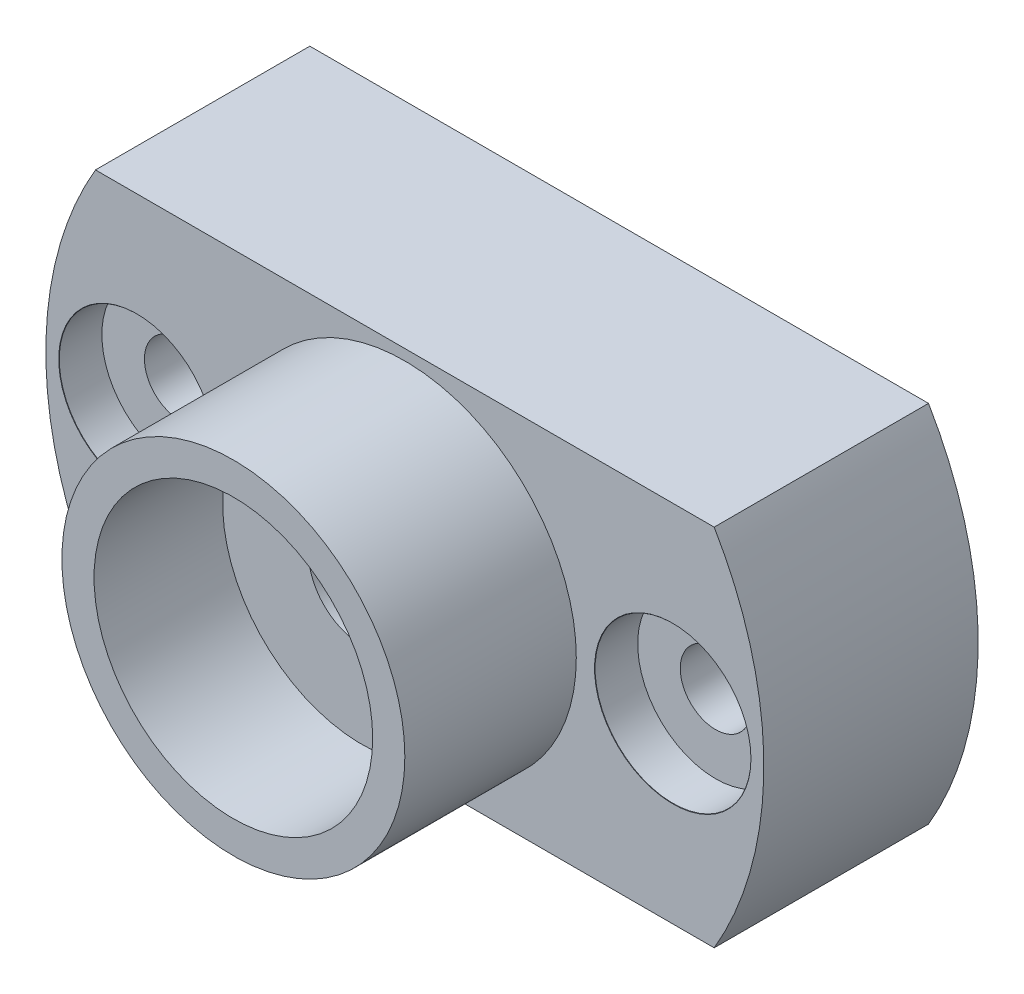
ISO-10303-21;
HEADER;
FILE_DESCRIPTION(('STEP AP214'),'2;1');
FILE_NAME('part.step','',(''),(''),'','','');
FILE_SCHEMA(('AUTOMOTIVE_DESIGN { 1 0 10303 214 1 1 1 1 }'));
ENDSEC;
DATA;
#1=APPLICATION_CONTEXT('core data for automotive mechanical design processes');
#2=APPLICATION_PROTOCOL_DEFINITION('international standard','automotive_design',2000,#1);
#3=PRODUCT_CONTEXT('',#1,'mechanical');
#4=PRODUCT('Part','Part','',(#3));
#5=PRODUCT_RELATED_PRODUCT_CATEGORY('part','',(#4));
#6=PRODUCT_DEFINITION_FORMATION('','',#4);
#7=PRODUCT_DEFINITION_CONTEXT('part definition',#1,'design');
#8=PRODUCT_DEFINITION('design','',#6,#7);
#9=PRODUCT_DEFINITION_SHAPE('','',#8);
#10=(LENGTH_UNIT() NAMED_UNIT(*) SI_UNIT(.MILLI.,.METRE.));
#11=(NAMED_UNIT(*) PLANE_ANGLE_UNIT() SI_UNIT($,.RADIAN.));
#12=(NAMED_UNIT(*) SI_UNIT($,.STERADIAN.) SOLID_ANGLE_UNIT());
#13=UNCERTAINTY_MEASURE_WITH_UNIT(LENGTH_MEASURE(1.E-05),#10,'distance_accuracy_value','');
#14=(GEOMETRIC_REPRESENTATION_CONTEXT(3) GLOBAL_UNCERTAINTY_ASSIGNED_CONTEXT((#13)) GLOBAL_UNIT_ASSIGNED_CONTEXT((#10,
#11,#12)) REPRESENTATION_CONTEXT('',''));
#15=CARTESIAN_POINT('',(0.,0.,0.));
#16=DIRECTION('',(0.,0.,1.));
#17=DIRECTION('',(1.,0.,0.));
#18=AXIS2_PLACEMENT_3D('',#15,#16,#17);
#19=CARTESIAN_POINT('',(0.,0.,-9.99999999999999));
#20=DIRECTION('',(0.,0.,1.));
#21=DIRECTION('',(1.,0.,0.));
#22=AXIS2_PLACEMENT_3D('',#19,#20,#21);
#23=CYLINDRICAL_SURFACE('',#22,5.);
#24=CARTESIAN_POINT('',(0.,0.,0.));
#25=DIRECTION('',(0.,0.,-1.));
#26=DIRECTION('',(-1.,0.,0.));
#27=AXIS2_PLACEMENT_3D('',#24,#25,#26);
#28=CIRCLE('',#27,5.);
#29=CARTESIAN_POINT('',(-5.,0.,0.));
#30=VERTEX_POINT('',#29);
#31=EDGE_CURVE('E148',#30,#30,#28,.T.);
#32=ORIENTED_EDGE('',*,*,#31,.T.);
#33=EDGE_LOOP('',(#32));
#34=FACE_BOUND('',#33,.T.);
#35=CARTESIAN_POINT('',(0.,0.,24.));
#36=DIRECTION('',(0.,0.,1.));
#37=DIRECTION('',(1.,0.,0.));
#38=AXIS2_PLACEMENT_3D('',#35,#36,#37);
#39=CIRCLE('',#38,5.);
#40=CARTESIAN_POINT('',(5.,0.,24.));
#41=VERTEX_POINT('',#40);
#42=EDGE_CURVE('E45',#41,#41,#39,.F.);
#43=ORIENTED_EDGE('',*,*,#42,.F.);
#44=EDGE_LOOP('',(#43));
#45=FACE_BOUND('',#44,.T.);
#46=ADVANCED_FACE('F41',(#34,#45),#23,.F.);
#47=CARTESIAN_POINT('',(-33.5,17.,20.));
#48=DIRECTION('',(0.,-1.,0.));
#49=DIRECTION('',(0.,0.,-1.));
#50=AXIS2_PLACEMENT_3D('',#47,#48,#49);
#51=PLANE('',#50);
#52=DIRECTION('',(0.,0.,1.));
#53=VECTOR('',#52,1.);
#54=CARTESIAN_POINT('',(28.8660700477221,17.,0.));
#55=LINE('',#54,#53);
#56=CARTESIAN_POINT('',(28.8660700477221,17.,0.));
#57=VERTEX_POINT('',#56);
#58=CARTESIAN_POINT('',(28.8660700477221,17.,20.));
#59=VERTEX_POINT('',#58);
#60=EDGE_CURVE('E81',#57,#59,#55,.T.);
#61=ORIENTED_EDGE('',*,*,#60,.F.);
#62=DIRECTION('',(-1.,0.,0.));
#63=VECTOR('',#62,1.);
#64=CARTESIAN_POINT('',(-33.5,17.,0.));
#65=LINE('',#64,#63);
#66=CARTESIAN_POINT('',(-28.8660700477221,17.,0.));
#67=VERTEX_POINT('',#66);
#68=EDGE_CURVE('E91',#57,#67,#65,.T.);
#69=ORIENTED_EDGE('',*,*,#68,.T.);
#70=DIRECTION('',(0.,0.,1.));
#71=VECTOR('',#70,1.);
#72=CARTESIAN_POINT('',(-28.8660700477221,17.,0.));
#73=LINE('',#72,#71);
#74=CARTESIAN_POINT('',(-28.8660700477221,17.,20.));
#75=VERTEX_POINT('',#74);
#76=EDGE_CURVE('E94',#75,#67,#73,.F.);
#77=ORIENTED_EDGE('',*,*,#76,.F.);
#78=DIRECTION('',(-1.,0.,0.));
#79=VECTOR('',#78,1.);
#80=CARTESIAN_POINT('',(-33.5,17.,20.));
#81=LINE('',#80,#79);
#82=EDGE_CURVE('E93',#59,#75,#81,.T.);
#83=ORIENTED_EDGE('',*,*,#82,.F.);
#84=EDGE_LOOP('',(#61,#69,#77,#83));
#85=FACE_BOUND('',#84,.T.);
#86=ADVANCED_FACE('F43',(#85),#51,.F.);
#87=CARTESIAN_POINT('',(-33.5,-17.,20.));
#88=DIRECTION('',(0.,1.,0.));
#89=DIRECTION('',(0.,0.,1.));
#90=AXIS2_PLACEMENT_3D('',#87,#88,#89);
#91=PLANE('',#90);
#92=DIRECTION('',(0.,0.,1.));
#93=VECTOR('',#92,1.);
#94=CARTESIAN_POINT('',(-28.8660700477221,-17.,0.));
#95=LINE('',#94,#93);
#96=CARTESIAN_POINT('',(-28.8660700477221,-17.,0.));
#97=VERTEX_POINT('',#96);
#98=CARTESIAN_POINT('',(-28.8660700477221,-17.,20.));
#99=VERTEX_POINT('',#98);
#100=EDGE_CURVE('E109',#97,#99,#95,.T.);
#101=ORIENTED_EDGE('',*,*,#100,.F.);
#102=DIRECTION('',(1.,0.,0.));
#103=VECTOR('',#102,1.);
#104=CARTESIAN_POINT('',(-33.5,-17.,0.));
#105=LINE('',#104,#103);
#106=CARTESIAN_POINT('',(28.8660700477221,-17.,0.));
#107=VERTEX_POINT('',#106);
#108=EDGE_CURVE('E98',#97,#107,#105,.T.);
#109=ORIENTED_EDGE('',*,*,#108,.T.);
#110=DIRECTION('',(0.,0.,1.));
#111=VECTOR('',#110,1.);
#112=CARTESIAN_POINT('',(28.8660700477221,-17.,0.));
#113=LINE('',#112,#111);
#114=CARTESIAN_POINT('',(28.8660700477221,-17.,20.));
#115=VERTEX_POINT('',#114);
#116=EDGE_CURVE('E58',#115,#107,#113,.F.);
#117=ORIENTED_EDGE('',*,*,#116,.F.);
#118=DIRECTION('',(1.,0.,0.));
#119=VECTOR('',#118,1.);
#120=CARTESIAN_POINT('',(-33.5,-17.,20.));
#121=LINE('',#120,#119);
#122=EDGE_CURVE('E102',#99,#115,#121,.T.);
#123=ORIENTED_EDGE('',*,*,#122,.F.);
#124=EDGE_LOOP('',(#101,#109,#117,#123));
#125=FACE_BOUND('',#124,.T.);
#126=ADVANCED_FACE('F169',(#125),#91,.F.);
#127=CARTESIAN_POINT('',(0.,0.,20.));
#128=DIRECTION('',(0.,0.,-1.));
#129=DIRECTION('',(-1.,0.,0.));
#130=AXIS2_PLACEMENT_3D('',#127,#128,#129);
#131=PLANE('',#130);
#132=CARTESIAN_POINT('',(-25.,0.,20.));
#133=DIRECTION('',(0.,0.,1.));
#134=DIRECTION('',(1.,0.,0.));
#135=AXIS2_PLACEMENT_3D('',#132,#133,#134);
#136=CIRCLE('',#135,7.2985);
#137=CARTESIAN_POINT('',(-17.7015,0.,20.));
#138=VERTEX_POINT('',#137);
#139=EDGE_CURVE('E145',#138,#138,#136,.T.);
#140=ORIENTED_EDGE('',*,*,#139,.F.);
#141=EDGE_LOOP('',(#140));
#142=FACE_BOUND('',#141,.T.);
#143=CARTESIAN_POINT('',(25.,0.,20.));
#144=DIRECTION('',(0.,0.,1.));
#145=DIRECTION('',(1.,0.,0.));
#146=AXIS2_PLACEMENT_3D('',#143,#144,#145);
#147=CIRCLE('',#146,7.2985);
#148=CARTESIAN_POINT('',(32.2985,0.,20.));
#149=VERTEX_POINT('',#148);
#150=EDGE_CURVE('E130',#149,#149,#147,.T.);
#151=ORIENTED_EDGE('',*,*,#150,.F.);
#152=EDGE_LOOP('',(#151));
#153=FACE_BOUND('',#152,.T.);
#154=CARTESIAN_POINT('',(0.,0.,20.));
#155=DIRECTION('',(0.,0.,1.));
#156=DIRECTION('',(1.,0.,0.));
#157=AXIS2_PLACEMENT_3D('',#154,#155,#156);
#158=CIRCLE('',#157,16.);
#159=CARTESIAN_POINT('',(16.,0.,20.));
#160=VERTEX_POINT('',#159);
#161=EDGE_CURVE('E12',#160,#160,#158,.T.);
#162=ORIENTED_EDGE('',*,*,#161,.F.);
#163=EDGE_LOOP('',(#162));
#164=FACE_BOUND('',#163,.T.);
#165=CARTESIAN_POINT('',(0.,0.,20.));
#166=DIRECTION('',(0.,0.,1.));
#167=DIRECTION('',(1.,0.,0.));
#168=AXIS2_PLACEMENT_3D('',#165,#166,#167);
#169=CIRCLE('',#168,33.5);
#170=EDGE_CURVE('E63',#115,#59,#169,.T.);
#171=ORIENTED_EDGE('',*,*,#170,.T.);
#172=ORIENTED_EDGE('',*,*,#82,.T.);
#173=EDGE_CURVE('E113',#75,#99,#169,.T.);
#174=ORIENTED_EDGE('',*,*,#173,.T.);
#175=ORIENTED_EDGE('',*,*,#122,.T.);
#176=EDGE_LOOP('',(#171,#172,#174,#175));
#177=FACE_BOUND('',#176,.T.);
#178=ADVANCED_FACE('F217',(#142,#153,#164,#177),#131,.F.);
#179=CARTESIAN_POINT('',(0.,0.,0.));
#180=DIRECTION('',(0.,0.,-1.));
#181=DIRECTION('',(-1.,0.,0.));
#182=AXIS2_PLACEMENT_3D('',#179,#180,#181);
#183=PLANE('',#182);
#184=ORIENTED_EDGE('',*,*,#31,.F.);
#185=EDGE_LOOP('',(#184));
#186=FACE_BOUND('',#185,.T.);
#187=CARTESIAN_POINT('',(-25.,0.,0.));
#188=DIRECTION('',(0.,0.,1.));
#189=DIRECTION('',(1.,0.,0.));
#190=AXIS2_PLACEMENT_3D('',#187,#188,#189);
#191=CIRCLE('',#190,3.29999999999999);
#192=CARTESIAN_POINT('',(-21.7,0.,0.));
#193=VERTEX_POINT('',#192);
#194=EDGE_CURVE('E133',#193,#193,#191,.T.);
#195=ORIENTED_EDGE('',*,*,#194,.T.);
#196=EDGE_LOOP('',(#195));
#197=FACE_BOUND('',#196,.T.);
#198=CARTESIAN_POINT('',(25.,0.,0.));
#199=DIRECTION('',(0.,0.,1.));
#200=DIRECTION('',(1.,0.,0.));
#201=AXIS2_PLACEMENT_3D('',#198,#199,#200);
#202=CIRCLE('',#201,3.29999999999999);
#203=CARTESIAN_POINT('',(28.3,0.,0.));
#204=VERTEX_POINT('',#203);
#205=EDGE_CURVE('E118',#204,#204,#202,.T.);
#206=ORIENTED_EDGE('',*,*,#205,.T.);
#207=EDGE_LOOP('',(#206));
#208=FACE_BOUND('',#207,.T.);
#209=ORIENTED_EDGE('',*,*,#68,.F.);
#210=CARTESIAN_POINT('',(0.,0.,0.));
#211=DIRECTION('',(0.,0.,-1.));
#212=DIRECTION('',(-1.,0.,0.));
#213=AXIS2_PLACEMENT_3D('',#210,#211,#212);
#214=CIRCLE('',#213,33.5);
#215=EDGE_CURVE('E50',#57,#107,#214,.T.);
#216=ORIENTED_EDGE('',*,*,#215,.T.);
#217=ORIENTED_EDGE('',*,*,#108,.F.);
#218=EDGE_CURVE('E87',#97,#67,#214,.T.);
#219=ORIENTED_EDGE('',*,*,#218,.T.);
#220=EDGE_LOOP('',(#209,#216,#217,#219));
#221=FACE_BOUND('',#220,.T.);
#222=ADVANCED_FACE('F96',(#186,#197,#208,#221),#183,.T.);
#223=CARTESIAN_POINT('',(0.,0.,0.));
#224=DIRECTION('',(0.,0.,1.));
#225=DIRECTION('',(1.,0.,0.));
#226=AXIS2_PLACEMENT_3D('',#223,#224,#225);
#227=CYLINDRICAL_SURFACE('',#226,33.5);
#228=ORIENTED_EDGE('',*,*,#76,.T.);
#229=ORIENTED_EDGE('',*,*,#218,.F.);
#230=ORIENTED_EDGE('',*,*,#100,.T.);
#231=ORIENTED_EDGE('',*,*,#173,.F.);
#232=EDGE_LOOP('',(#228,#229,#230,#231));
#233=FACE_BOUND('',#232,.T.);
#234=ADVANCED_FACE('F216',(#233),#227,.T.);
#235=ORIENTED_EDGE('',*,*,#215,.F.);
#236=ORIENTED_EDGE('',*,*,#60,.T.);
#237=ORIENTED_EDGE('',*,*,#170,.F.);
#238=ORIENTED_EDGE('',*,*,#116,.T.);
#239=EDGE_LOOP('',(#235,#236,#237,#238));
#240=FACE_BOUND('',#239,.T.);
#241=ADVANCED_FACE('F80',(#240),#227,.T.);
#242=CARTESIAN_POINT('',(0.,0.,36.));
#243=DIRECTION('',(0.,0.,-1.));
#244=DIRECTION('',(-1.,0.,0.));
#245=AXIS2_PLACEMENT_3D('',#242,#243,#244);
#246=CYLINDRICAL_SURFACE('',#245,16.);
#247=CARTESIAN_POINT('',(0.,0.,36.));
#248=DIRECTION('',(0.,0.,1.));
#249=DIRECTION('',(1.,0.,0.));
#250=AXIS2_PLACEMENT_3D('',#247,#248,#249);
#251=CIRCLE('',#250,16.);
#252=CARTESIAN_POINT('',(16.,0.,36.));
#253=VERTEX_POINT('',#252);
#254=EDGE_CURVE('E114',#253,#253,#251,.T.);
#255=ORIENTED_EDGE('',*,*,#254,.F.);
#256=EDGE_LOOP('',(#255));
#257=FACE_BOUND('',#256,.T.);
#258=ORIENTED_EDGE('',*,*,#161,.T.);
#259=EDGE_LOOP('',(#258));
#260=FACE_BOUND('',#259,.T.);
#261=ADVANCED_FACE('F209',(#257,#260),#246,.T.);
#262=CARTESIAN_POINT('',(0.,0.,36.));
#263=DIRECTION('',(0.,0.,1.));
#264=DIRECTION('',(1.,0.,0.));
#265=AXIS2_PLACEMENT_3D('',#262,#263,#264);
#266=PLANE('',#265);
#267=CARTESIAN_POINT('',(0.,0.,36.));
#268=DIRECTION('',(0.,0.,1.));
#269=DIRECTION('',(1.,0.,0.));
#270=AXIS2_PLACEMENT_3D('',#267,#268,#269);
#271=CIRCLE('',#270,13.);
#272=CARTESIAN_POINT('',(13.,0.,36.));
#273=VERTEX_POINT('',#272);
#274=EDGE_CURVE('E151',#273,#273,#271,.T.);
#275=ORIENTED_EDGE('',*,*,#274,.F.);
#276=EDGE_LOOP('',(#275));
#277=FACE_BOUND('',#276,.T.);
#278=ORIENTED_EDGE('',*,*,#254,.T.);
#279=EDGE_LOOP('',(#278));
#280=FACE_BOUND('',#279,.T.);
#281=ADVANCED_FACE('F205',(#277,#280),#266,.T.);
#282=CARTESIAN_POINT('',(25.,0.,20.));
#283=DIRECTION('',(0.,0.,1.));
#284=DIRECTION('',(1.,0.,0.));
#285=AXIS2_PLACEMENT_3D('',#282,#283,#284);
#286=CYLINDRICAL_SURFACE('',#285,3.3);
#287=ORIENTED_EDGE('',*,*,#205,.F.);
#288=EDGE_LOOP('',(#287));
#289=FACE_BOUND('',#288,.T.);
#290=CARTESIAN_POINT('',(25.,0.,16.));
#291=DIRECTION('',(0.,0.,1.));
#292=DIRECTION('',(1.,0.,0.));
#293=AXIS2_PLACEMENT_3D('',#290,#291,#292);
#294=CIRCLE('',#293,3.3);
#295=CARTESIAN_POINT('',(28.3,0.,16.));
#296=VERTEX_POINT('',#295);
#297=EDGE_CURVE('E121',#296,#296,#294,.T.);
#298=ORIENTED_EDGE('',*,*,#297,.T.);
#299=EDGE_LOOP('',(#298));
#300=FACE_BOUND('',#299,.T.);
#301=ADVANCED_FACE('F201',(#289,#300),#286,.F.);
#302=CARTESIAN_POINT('',(32.2735,0.,16.));
#303=DIRECTION('',(0.,0.,-1.));
#304=DIRECTION('',(-1.,0.,0.));
#305=AXIS2_PLACEMENT_3D('',#302,#303,#304);
#306=PLANE('',#305);
#307=ORIENTED_EDGE('',*,*,#297,.F.);
#308=EDGE_LOOP('',(#307));
#309=FACE_BOUND('',#308,.T.);
#310=CARTESIAN_POINT('',(25.,0.,16.));
#311=DIRECTION('',(0.,0.,1.));
#312=DIRECTION('',(1.,0.,0.));
#313=AXIS2_PLACEMENT_3D('',#310,#311,#312);
#314=CIRCLE('',#313,7.2735);
#315=CARTESIAN_POINT('',(32.2735,0.,16.));
#316=VERTEX_POINT('',#315);
#317=EDGE_CURVE('E124',#316,#316,#314,.T.);
#318=ORIENTED_EDGE('',*,*,#317,.T.);
#319=EDGE_LOOP('',(#318));
#320=FACE_BOUND('',#319,.T.);
#321=ADVANCED_FACE('F197',(#309,#320),#306,.F.);
#322=CARTESIAN_POINT('',(25.,0.,20.));
#323=DIRECTION('',(0.,0.,1.));
#324=DIRECTION('',(1.,0.,0.));
#325=AXIS2_PLACEMENT_3D('',#322,#323,#324);
#326=CYLINDRICAL_SURFACE('',#325,7.2735);
#327=ORIENTED_EDGE('',*,*,#317,.F.);
#328=EDGE_LOOP('',(#327));
#329=FACE_BOUND('',#328,.T.);
#330=CARTESIAN_POINT('',(25.,0.,19.975));
#331=DIRECTION('',(0.,0.,1.));
#332=DIRECTION('',(1.,0.,0.));
#333=AXIS2_PLACEMENT_3D('',#330,#331,#332);
#334=CIRCLE('',#333,7.2735);
#335=CARTESIAN_POINT('',(32.2735,0.,19.975));
#336=VERTEX_POINT('',#335);
#337=EDGE_CURVE('E127',#336,#336,#334,.T.);
#338=ORIENTED_EDGE('',*,*,#337,.T.);
#339=EDGE_LOOP('',(#338));
#340=FACE_BOUND('',#339,.T.);
#341=ADVANCED_FACE('F193',(#329,#340),#326,.F.);
#342=CARTESIAN_POINT('',(25.,0.,20.));
#343=DIRECTION('',(0.,0.,1.));
#344=DIRECTION('',(1.,0.,0.));
#345=AXIS2_PLACEMENT_3D('',#342,#343,#344);
#346=CONICAL_SURFACE('',#345,7.2985,0.785398163397379);
#347=ORIENTED_EDGE('',*,*,#337,.F.);
#348=EDGE_LOOP('',(#347));
#349=FACE_BOUND('',#348,.T.);
#350=ORIENTED_EDGE('',*,*,#150,.T.);
#351=EDGE_LOOP('',(#350));
#352=FACE_BOUND('',#351,.T.);
#353=ADVANCED_FACE('F189',(#349,#352),#346,.F.);
#354=CARTESIAN_POINT('',(-25.,0.,20.));
#355=DIRECTION('',(0.,0.,1.));
#356=DIRECTION('',(1.,0.,0.));
#357=AXIS2_PLACEMENT_3D('',#354,#355,#356);
#358=CYLINDRICAL_SURFACE('',#357,3.3);
#359=ORIENTED_EDGE('',*,*,#194,.F.);
#360=EDGE_LOOP('',(#359));
#361=FACE_BOUND('',#360,.T.);
#362=CARTESIAN_POINT('',(-25.,0.,16.));
#363=DIRECTION('',(0.,0.,1.));
#364=DIRECTION('',(1.,0.,0.));
#365=AXIS2_PLACEMENT_3D('',#362,#363,#364);
#366=CIRCLE('',#365,3.3);
#367=CARTESIAN_POINT('',(-21.7,0.,16.));
#368=VERTEX_POINT('',#367);
#369=EDGE_CURVE('E136',#368,#368,#366,.T.);
#370=ORIENTED_EDGE('',*,*,#369,.T.);
#371=EDGE_LOOP('',(#370));
#372=FACE_BOUND('',#371,.T.);
#373=ADVANCED_FACE('F185',(#361,#372),#358,.F.);
#374=CARTESIAN_POINT('',(-17.7265,0.,16.));
#375=DIRECTION('',(0.,0.,-1.));
#376=DIRECTION('',(-1.,0.,0.));
#377=AXIS2_PLACEMENT_3D('',#374,#375,#376);
#378=PLANE('',#377);
#379=ORIENTED_EDGE('',*,*,#369,.F.);
#380=EDGE_LOOP('',(#379));
#381=FACE_BOUND('',#380,.T.);
#382=CARTESIAN_POINT('',(-25.,0.,16.));
#383=DIRECTION('',(0.,0.,1.));
#384=DIRECTION('',(1.,0.,0.));
#385=AXIS2_PLACEMENT_3D('',#382,#383,#384);
#386=CIRCLE('',#385,7.2735);
#387=CARTESIAN_POINT('',(-17.7265,0.,16.));
#388=VERTEX_POINT('',#387);
#389=EDGE_CURVE('E139',#388,#388,#386,.T.);
#390=ORIENTED_EDGE('',*,*,#389,.T.);
#391=EDGE_LOOP('',(#390));
#392=FACE_BOUND('',#391,.T.);
#393=ADVANCED_FACE('F181',(#381,#392),#378,.F.);
#394=CARTESIAN_POINT('',(-25.,0.,20.));
#395=DIRECTION('',(0.,0.,1.));
#396=DIRECTION('',(1.,0.,0.));
#397=AXIS2_PLACEMENT_3D('',#394,#395,#396);
#398=CYLINDRICAL_SURFACE('',#397,7.2735);
#399=ORIENTED_EDGE('',*,*,#389,.F.);
#400=EDGE_LOOP('',(#399));
#401=FACE_BOUND('',#400,.T.);
#402=CARTESIAN_POINT('',(-25.,0.,19.975));
#403=DIRECTION('',(0.,0.,1.));
#404=DIRECTION('',(1.,0.,0.));
#405=AXIS2_PLACEMENT_3D('',#402,#403,#404);
#406=CIRCLE('',#405,7.2735);
#407=CARTESIAN_POINT('',(-17.7265,0.,19.975));
#408=VERTEX_POINT('',#407);
#409=EDGE_CURVE('E142',#408,#408,#406,.T.);
#410=ORIENTED_EDGE('',*,*,#409,.T.);
#411=EDGE_LOOP('',(#410));
#412=FACE_BOUND('',#411,.T.);
#413=ADVANCED_FACE('F177',(#401,#412),#398,.F.);
#414=CARTESIAN_POINT('',(-25.,0.,20.));
#415=DIRECTION('',(0.,0.,1.));
#416=DIRECTION('',(1.,0.,0.));
#417=AXIS2_PLACEMENT_3D('',#414,#415,#416);
#418=CONICAL_SURFACE('',#417,7.2985,0.785398163397448);
#419=ORIENTED_EDGE('',*,*,#409,.F.);
#420=EDGE_LOOP('',(#419));
#421=FACE_BOUND('',#420,.T.);
#422=ORIENTED_EDGE('',*,*,#139,.T.);
#423=EDGE_LOOP('',(#422));
#424=FACE_BOUND('',#423,.T.);
#425=ADVANCED_FACE('F174',(#421,#424),#418,.F.);
#426=CARTESIAN_POINT('',(0.,0.,24.));
#427=DIRECTION('',(0.,0.,1.));
#428=DIRECTION('',(1.,0.,0.));
#429=AXIS2_PLACEMENT_3D('',#426,#427,#428);
#430=PLANE('',#429);
#431=CARTESIAN_POINT('',(0.,0.,24.));
#432=DIRECTION('',(0.,0.,1.));
#433=DIRECTION('',(1.,0.,0.));
#434=AXIS2_PLACEMENT_3D('',#431,#432,#433);
#435=CIRCLE('',#434,13.);
#436=CARTESIAN_POINT('',(13.,0.,24.));
#437=VERTEX_POINT('',#436);
#438=EDGE_CURVE('E154',#437,#437,#435,.T.);
#439=ORIENTED_EDGE('',*,*,#438,.T.);
#440=EDGE_LOOP('',(#439));
#441=FACE_BOUND('',#440,.T.);
#442=ORIENTED_EDGE('',*,*,#42,.T.);
#443=EDGE_LOOP('',(#442));
#444=FACE_BOUND('',#443,.T.);
#445=ADVANCED_FACE('F161',(#441,#444),#430,.T.);
#446=CARTESIAN_POINT('',(0.,0.,24.));
#447=DIRECTION('',(0.,0.,1.));
#448=DIRECTION('',(1.,0.,0.));
#449=AXIS2_PLACEMENT_3D('',#446,#447,#448);
#450=CYLINDRICAL_SURFACE('',#449,13.);
#451=ORIENTED_EDGE('',*,*,#438,.F.);
#452=EDGE_LOOP('',(#451));
#453=FACE_BOUND('',#452,.T.);
#454=ORIENTED_EDGE('',*,*,#274,.T.);
#455=EDGE_LOOP('',(#454));
#456=FACE_BOUND('',#455,.T.);
#457=ADVANCED_FACE('F172',(#453,#456),#450,.F.);
#458=CLOSED_SHELL('',(#46,#86,#126,#178,#222,#234,#241,#261,#281,#301,#321,#341,#353,#373,#393,
#413,#425,#445,#457));
#459=MANIFOLD_SOLID_BREP('B2',#458);
#460=ADVANCED_BREP_SHAPE_REPRESENTATION('',(#18,#459),#14);
#461=SHAPE_DEFINITION_REPRESENTATION(#9,#460);
ENDSEC;
END-ISO-10303-21;
